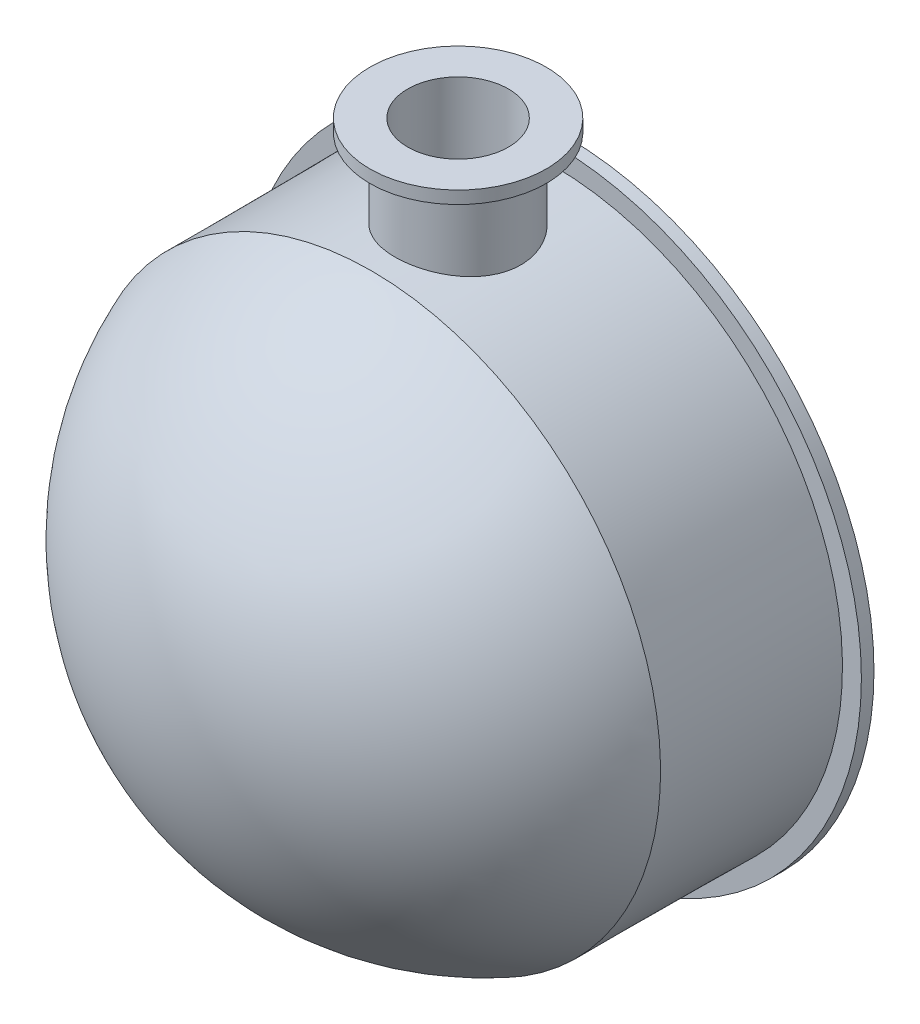
ISO-10303-21;
HEADER;
FILE_DESCRIPTION(('STEP AP214'),'2;1');
FILE_NAME('part.step','',(''),(''),'','','');
FILE_SCHEMA(('AUTOMOTIVE_DESIGN { 1 0 10303 214 1 1 1 1 }'));
ENDSEC;
DATA;
#1=APPLICATION_CONTEXT('core data for automotive mechanical design processes');
#2=APPLICATION_PROTOCOL_DEFINITION('international standard','automotive_design',2000,#1);
#3=PRODUCT_CONTEXT('',#1,'mechanical');
#4=PRODUCT('Part','Part','',(#3));
#5=PRODUCT_RELATED_PRODUCT_CATEGORY('part','',(#4));
#6=PRODUCT_DEFINITION_FORMATION('','',#4);
#7=PRODUCT_DEFINITION_CONTEXT('part definition',#1,'design');
#8=PRODUCT_DEFINITION('design','',#6,#7);
#9=PRODUCT_DEFINITION_SHAPE('','',#8);
#10=(LENGTH_UNIT() NAMED_UNIT(*) SI_UNIT(.MILLI.,.METRE.));
#11=(NAMED_UNIT(*) PLANE_ANGLE_UNIT() SI_UNIT($,.RADIAN.));
#12=(NAMED_UNIT(*) SI_UNIT($,.STERADIAN.) SOLID_ANGLE_UNIT());
#13=UNCERTAINTY_MEASURE_WITH_UNIT(LENGTH_MEASURE(1.E-05),#10,'distance_accuracy_value','');
#14=(GEOMETRIC_REPRESENTATION_CONTEXT(3) GLOBAL_UNCERTAINTY_ASSIGNED_CONTEXT((#13)) GLOBAL_UNIT_ASSIGNED_CONTEXT((#10,
#11,#12)) REPRESENTATION_CONTEXT('',''));
#15=CARTESIAN_POINT('',(0.,0.,0.));
#16=DIRECTION('',(0.,0.,1.));
#17=DIRECTION('',(1.,0.,0.));
#18=AXIS2_PLACEMENT_3D('',#15,#16,#17);
#19=CARTESIAN_POINT('',(0.,-245.001,85.));
#20=DIRECTION('',(0.,1.,0.));
#21=DIRECTION('',(0.,0.,1.));
#22=AXIS2_PLACEMENT_3D('',#19,#20,#21);
#23=CYLINDRICAL_SURFACE('',#22,50.);
#24=CARTESIAN_POINT('',(-35.4781241420228,227.053585489584,49.7678739306976));
#25=CARTESIAN_POINT('',(-36.4650378574734,226.894536222528,50.7616868783154));
#26=CARTESIAN_POINT('',(-37.4102609497926,226.735193766023,51.7970706430749));
#27=CARTESIAN_POINT('',(-39.2107967543285,226.420280433683,53.9439726547816));
#28=CARTESIAN_POINT('',(-40.0660960604967,226.26471012286,55.0555022130419));
#29=CARTESIAN_POINT('',(-41.6813099409951,225.961528320691,57.3479561148434));
#30=CARTESIAN_POINT('',(-42.4411640498901,225.813921907985,58.528923759607));
#31=CARTESIAN_POINT('',(-43.8593920727948,225.530880320074,60.9516343104096));
#32=CARTESIAN_POINT('',(-44.517770011498,225.395444662248,62.1933748035334));
#33=CARTESIAN_POINT('',(-45.7285772420085,225.140465264794,64.7299864229331));
#34=CARTESIAN_POINT('',(-46.2809431953221,225.020931038726,66.0248887542525));
#35=CARTESIAN_POINT('',(-47.2749822792751,224.801248008271,68.658135036125));
#36=CARTESIAN_POINT('',(-47.7166543089995,224.701099396686,69.996479418585));
#37=CARTESIAN_POINT('',(-48.4856558939317,224.523082179764,72.7067165236855));
#38=CARTESIAN_POINT('',(-48.8130147921544,224.445207857774,74.0786005401553));
#39=CARTESIAN_POINT('',(-49.3508203406092,224.313936395497,76.846246196221));
#40=CARTESIAN_POINT('',(-49.5612690069591,224.26053883311,78.2420074236264));
#41=CARTESIAN_POINT('',(-49.8610752316573,224.180354166085,81.0249614004054));
#42=CARTESIAN_POINT('',(-49.9522879178295,224.15316116059,82.4119428217344));
#43=CARTESIAN_POINT('',(-50.0189292642051,224.124611218261,85.1889458545698));
#44=CARTESIAN_POINT('',(-49.9943590402981,224.123254032427,86.5789674366469));
#45=CARTESIAN_POINT('',(-49.8296109891714,224.146273831468,89.3518847411889));
#46=CARTESIAN_POINT('',(-49.6894362206847,224.170650135476,90.7347806512149));
#47=CARTESIAN_POINT('',(-49.2946121347154,224.244261822133,93.4834531060378));
#48=CARTESIAN_POINT('',(-49.0399631691599,224.293497128358,94.8492297034511));
#49=CARTESIAN_POINT('',(-48.4216906813438,224.414541671922,97.5388533789315));
#50=CARTESIAN_POINT('',(-48.059307881108,224.486094328267,98.8629975698894));
#51=CARTESIAN_POINT('',(-47.227386602401,224.649740111248,101.47585300831));
#52=CARTESIAN_POINT('',(-46.7578491397839,224.741833043157,102.764564591552));
#53=CARTESIAN_POINT('',(-45.7150827842687,224.943822384196,105.297974227925));
#54=CARTESIAN_POINT('',(-45.1418465147905,225.053720059802,106.54266914241));
#55=CARTESIAN_POINT('',(-43.8958331283284,225.288118239137,108.979760535407));
#56=CARTESIAN_POINT('',(-43.2230544482614,225.412618972167,110.1721561923));
#57=CARTESIAN_POINT('',(-41.7713481924228,225.674717172918,112.515147570935));
#58=CARTESIAN_POINT('',(-40.9909228741811,225.812489251062,113.664795878414));
#59=CARTESIAN_POINT('',(-39.3376370406178,226.095470965211,115.894606922619));
#60=CARTESIAN_POINT('',(-38.464775705425,226.240680667178,116.974769042894));
#61=CARTESIAN_POINT('',(-36.6324227486595,226.534431176486,119.05863753563));
#62=CARTESIAN_POINT('',(-35.6729223123323,226.682972321612,120.062336109413));
#63=CARTESIAN_POINT('',(-33.6737248851682,226.979203098481,121.986553697899));
#64=CARTESIAN_POINT('',(-32.6340271393408,227.126892722193,122.907071929353));
#65=CARTESIAN_POINT('',(-30.462309036998,227.419859799267,124.674194843557));
#66=CARTESIAN_POINT('',(-29.3289864745701,227.565049134088,125.519214681602));
#67=CARTESIAN_POINT('',(-26.9940587078946,227.846105375582,127.110771288229));
#68=CARTESIAN_POINT('',(-25.7924525961479,227.981972158305,127.857306747502));
#69=CARTESIAN_POINT('',(-23.3292555922674,228.240462879519,129.24641179917));
#70=CARTESIAN_POINT('',(-22.0676667995242,228.363087281004,129.888985026777));
#71=CARTESIAN_POINT('',(-19.493278855762,228.591549035558,131.06533205735));
#72=CARTESIAN_POINT('',(-18.1804803275159,228.697386592696,131.599107182943));
#73=CARTESIAN_POINT('',(-15.5226077157674,228.888504850118,132.550252667552));
#74=CARTESIAN_POINT('',(-14.1778336008463,228.973927897985,132.968432469416));
#75=CARTESIAN_POINT('',(-11.4566478325701,229.12272351738,133.690107565286));
#76=CARTESIAN_POINT('',(-10.0802362704543,229.186096152492,133.993603189987));
#77=CARTESIAN_POINT('',(-7.3059916973337,229.288941213701,134.483394515538));
#78=CARTESIAN_POINT('',(-5.90816118758374,229.328416409003,134.669703795889));
#79=CARTESIAN_POINT('',(-3.10128680205962,229.382323102537,134.923618504976));
#80=CARTESIAN_POINT('',(-1.69224309237348,229.396754971015,134.991225688632));
#81=CARTESIAN_POINT('',(1.09887198392788,229.400121454819,135.007017654618));
#82=CARTESIAN_POINT('',(2.48093021795338,229.389550706048,134.957519176243));
#83=CARTESIAN_POINT('',(5.23579073704766,229.344234794562,134.744297345343));
#84=CARTESIAN_POINT('',(6.60859315239523,229.309489972826,134.580575603953));
#85=CARTESIAN_POINT('',(9.33514321532102,229.216803459669,134.14022904555));
#86=CARTESIAN_POINT('',(10.6888911183809,229.158862079574,133.863605743808));
#87=CARTESIAN_POINT('',(13.3678322467135,229.02140384041,133.199641991551));
#88=CARTESIAN_POINT('',(14.6930253217094,228.941886867825,132.812300958511));
#89=CARTESIAN_POINT('',(17.3037438400605,228.763621884184,131.930544508968));
#90=CARTESIAN_POINT('',(18.5893252647132,228.664902605056,131.43628894366));
#91=CARTESIAN_POINT('',(21.1141871159282,228.450877157492,130.344052658669));
#92=CARTESIAN_POINT('',(22.3534676931093,228.335571043019,129.746072276443));
#93=CARTESIAN_POINT('',(24.777645766187,228.091515080126,128.450629159186));
#94=CARTESIAN_POINT('',(25.9625380948951,227.962763958144,127.753156997627));
#95=CARTESIAN_POINT('',(28.2701160075721,227.695332829416,126.263622451507));
#96=CARTESIAN_POINT('',(29.3928006304103,227.556652669338,125.471558606068));
#97=CARTESIAN_POINT('',(31.5892334882116,227.270461250141,123.782414045929));
#98=CARTESIAN_POINT('',(32.6616619172846,227.122832862631,122.883636486655));
#99=CARTESIAN_POINT('',(34.7272987941957,226.825352394477,120.999568467029));
#100=CARTESIAN_POINT('',(35.720506278764,226.67550028682,120.014276955035));
#101=CARTESIAN_POINT('',(37.6211148587971,226.377819232324,117.963709253164));
#102=CARTESIAN_POINT('',(38.528509215784,226.229990445143,116.898426793759));
#103=CARTESIAN_POINT('',(40.2512188066684,225.94061159074,114.695034325978));
#104=CARTESIAN_POINT('',(41.066533772289,225.799061541811,113.556924105431));
#105=CARTESIAN_POINT('',(42.6075399144435,225.524911371917,111.203002962289));
#106=CARTESIAN_POINT('',(43.33218613026,225.392422398136,109.986494618241));
#107=CARTESIAN_POINT('',(44.6762661686417,225.142080035108,107.495210531761));
#108=CARTESIAN_POINT('',(45.2956990152833,225.02422678162,106.220434248995));
#109=CARTESIAN_POINT('',(46.4245560632898,224.80681434376,103.621689293145));
#110=CARTESIAN_POINT('',(46.9339906728047,224.707253428682,102.297725288162));
#111=CARTESIAN_POINT('',(47.8388791687369,224.529570732241,99.6100032740788));
#112=CARTESIAN_POINT('',(48.2343350542319,224.451448574864,98.246245963377));
#113=CARTESIAN_POINT('',(48.9029384373739,224.320190768538,95.5098176669113));
#114=CARTESIAN_POINT('',(49.1778467476316,224.266694790465,94.1375941020726));
#115=CARTESIAN_POINT('',(49.6117492808648,224.184724250604,91.3741987191269));
#116=CARTESIAN_POINT('',(49.7707445641322,224.156249459938,89.9830270744622));
#117=CARTESIAN_POINT('',(49.9715105901728,224.125334842356,87.1921061473805));
#118=CARTESIAN_POINT('',(50.0132934493609,224.122892324374,85.7923577665454));
#119=CARTESIAN_POINT('',(49.9793476576777,224.144255830882,82.9944957295606));
#120=CARTESIAN_POINT('',(49.9036201704198,224.168061595457,81.5963820573609));
#121=CARTESIAN_POINT('',(49.6377116699164,224.240687239164,78.8368072436733));
#122=CARTESIAN_POINT('',(49.4495838356155,224.28905610974,77.4751357663475));
#123=CARTESIAN_POINT('',(48.9621454492144,224.409273508556,74.7729195748298));
#124=CARTESIAN_POINT('',(48.6628364144279,224.481121716368,73.4323745725808));
#125=CARTESIAN_POINT('',(47.9553953963934,224.646353148208,70.78163539879));
#126=CARTESIAN_POINT('',(47.5472592871466,224.739737188713,69.4714423800411));
#127=CARTESIAN_POINT('',(46.6252930363948,224.945500488639,66.8903295323872));
#128=CARTESIAN_POINT('',(46.1114615930524,225.057879982022,65.6194101874333));
#129=CARTESIAN_POINT('',(44.9772742843771,225.299582834235,63.1150797388412));
#130=CARTESIAN_POINT('',(44.356081982215,225.429037189437,61.8820601653862));
#131=CARTESIAN_POINT('',(43.0145970583337,225.70064974685,59.4726477294793));
#132=CARTESIAN_POINT('',(42.2943041165064,225.842807990095,58.2962550499562));
#133=CARTESIAN_POINT('',(40.7595250965984,226.136027186074,56.0075920032973));
#134=CARTESIAN_POINT('',(39.945028012822,226.287089178004,54.8953291511229));
#135=CARTESIAN_POINT('',(38.227375354719,226.594086285504,52.7422193917341));
#136=CARTESIAN_POINT('',(37.3242184684326,226.750021473163,51.7013735417132));
#137=CARTESIAN_POINT('',(35.4145400855198,227.066065981761,49.6759341245209));
#138=CARTESIAN_POINT('',(34.4061933912496,227.226192148412,48.69306320163));
#139=CARTESIAN_POINT('',(32.3098942705791,227.542854267718,46.8155705395844));
#140=CARTESIAN_POINT('',(31.2219406405958,227.699390166045,45.9209501351761));
#141=CARTESIAN_POINT('',(28.9737007327615,228.004592006165,44.2261553671492));
#142=CARTESIAN_POINT('',(27.8134124395351,228.153257728468,43.4259836368413));
#143=CARTESIAN_POINT('',(25.4283685430601,228.438635296993,41.9258459292871));
#144=CARTESIAN_POINT('',(24.2036132714549,228.575347204701,41.2258794366146));
#145=CARTESIAN_POINT('',(21.6952244846365,228.833332936976,39.9298933888488));
#146=CARTESIAN_POINT('',(20.4114661151911,228.954571760992,39.3341084075272));
#147=CARTESIAN_POINT('',(17.7966120778687,229.177867882313,38.2529987647251));
#148=CARTESIAN_POINT('',(16.4655162131774,229.279925099855,37.7676745625678));
#149=CARTESIAN_POINT('',(13.7657407875155,229.461967634332,36.9114405264882));
#150=CARTESIAN_POINT('',(12.3970665471054,229.541956058354,36.5405145854568));
#151=CARTESIAN_POINT('',(9.63201432782994,229.677604012853,35.9160612599151));
#152=CARTESIAN_POINT('',(8.23563689487152,229.733264022238,35.6625315644378));
#153=CARTESIAN_POINT('',(5.45433695093589,229.817791300223,35.2789733279381));
#154=CARTESIAN_POINT('',(4.06976334544715,229.847182768079,35.1465272230307));
#155=CARTESIAN_POINT('',(1.29409333912561,229.880284565223,34.9974311897477));
#156=CARTESIAN_POINT('',(-0.0970029863859533,229.883995190334,34.9807799275084));
#157=CARTESIAN_POINT('',(-2.87566220857087,229.865632086176,35.0634135295426));
#158=CARTESIAN_POINT('',(-4.26322486974165,229.843556681238,35.1627059282463));
#159=CARTESIAN_POINT('',(-7.02462025482439,229.774229359974,35.4764136788926));
#160=CARTESIAN_POINT('',(-8.3984531342792,229.726977729195,35.690827725128));
#161=CARTESIAN_POINT('',(-11.1066657368185,229.609288994176,36.2298645906195));
#162=CARTESIAN_POINT('',(-12.4413183702826,229.53912757455,36.5531783579723));
#163=CARTESIAN_POINT('',(-15.0783555789569,229.377355783174,37.3080285056092));
#164=CARTESIAN_POINT('',(-16.3807393794887,229.285744897038,37.7395674812966));
#165=CARTESIAN_POINT('',(-18.9436799474876,229.083558875408,38.7073171267504));
#166=CARTESIAN_POINT('',(-20.2042581240921,228.97299363139,39.2434732213408));
#167=CARTESIAN_POINT('',(-22.6758688361389,228.735772346267,40.4166423866229));
#168=CARTESIAN_POINT('',(-23.8869073472597,228.609118253477,41.0536432475916));
#169=CARTESIAN_POINT('',(-26.0207354789631,228.369006557788,42.2901504529414));
#170=CARTESIAN_POINT('',(-26.9536535814575,228.2577976198,42.8727115514449));
#171=CARTESIAN_POINT('',(-28.7787670256343,228.028934413537,44.0977919231756));
#172=CARTESIAN_POINT('',(-29.6709535812979,227.911278766602,44.7403240423341));
#173=CARTESIAN_POINT('',(-31.4107238040844,227.671507110118,46.082477928245));
#174=CARTESIAN_POINT('',(-32.2583056407016,227.549390917864,46.7821020349598));
#175=CARTESIAN_POINT('',(-33.9051666803032,227.302771377165,48.235267106976));
#176=CARTESIAN_POINT('',(-34.7044557246762,227.178268521948,48.9887970182128));
#177=CARTESIAN_POINT('',(-35.4781241420228,227.053585489584,49.7678739306976));
#178=B_SPLINE_CURVE_WITH_KNOTS('',3,(#24,#25,#26,#27,#28,#29,#30,#31,#32,#33,#34,#35,#36,#37,
#38,#39,#40,#41,#42,#43,#44,#45,#46,#47,#48,#49,#50,#51,#52,#53,#54,#55,#56,#57,#58,#59,#60,#61,
#62,#63,#64,#65,#66,#67,#68,#69,#70,#71,#72,#73,#74,#75,#76,#77,#78,#79,#80,#81,#82,#83,#84,#85,
#86,#87,#88,#89,#90,#91,#92,#93,#94,#95,#96,#97,#98,#99,#100,#101,#102,#103,#104,#105,#106,#107,
#108,#109,#110,#111,#112,#113,#114,#115,#116,#117,#118,#119,#120,#121,#122,#123,#124,#125,#126,
#127,#128,#129,#130,#131,#132,#133,#134,#135,#136,#137,#138,#139,#140,#141,#142,#143,#144,#145,
#146,#147,#148,#149,#150,#151,#152,#153,#154,#155,#156,#157,#158,#159,#160,#161,#162,#163,#164,
#165,#166,#167,#168,#169,#170,#171,#172,#173,#174,#175,#176,#177),.UNSPECIFIED.,.T.,.F.,(4,2,2,
2,2,2,2,2,2,2,2,2,2,2,2,2,2,2,2,2,2,2,2,2,2,2,2,2,2,2,2,2,2,2,2,2,2,2,2,2,2,2,2,2,2,2,2,2,2,2,2,
2,2,2,2,2,2,2,2,2,2,2,2,2,2,2,2,2,2,2,2,2,2,2,2,2,4),(0.,4.22782266465638,8.45627473192756,
12.6873921962451,16.9183418050378,21.1518114438061,25.3853231852076,29.6177474271291,
33.8500986785991,38.0157849514535,42.1814310764417,46.3469669878496,50.5124900932706,
54.6317857349764,58.7510423263048,62.8705920548893,66.9902064783324,71.1743553724176,
75.3585413813699,79.5431535745588,83.7278051671741,87.9860604346383,92.2443723082307,
96.5025352506988,100.760646424841,104.988138385531,109.215618156059,113.442607957817,
117.669535266216,121.813541236799,125.957488756801,130.101380662002,134.245294370146,
138.383054689612,142.520801547581,146.658940704487,150.797143779264,155.013281224023,
159.229469926184,163.445989430244,167.66252121898,171.923879935512,176.185278176809,
180.446273023212,184.707193131301,188.903614113649,193.099996709568,197.295945503461,
201.491852748404,205.613362518345,209.734816043223,213.856425848432,217.978086422081,
222.133439023571,226.288805047707,230.444657026872,234.600570512297,238.847152126142,
243.093797957636,247.340562161338,251.587304520154,255.84348900108,260.099691179946,
264.355293817856,268.610812679876,272.779381709175,276.947902719816,281.116694630807,
285.285439260455,289.405762083262,293.526183727064,297.644461606783,301.762241249133,
305.076376433931,308.391223150518,311.706205797157,315.020510602713),.UNSPECIFIED.);
#179=CARTESIAN_POINT('',(-35.4781241420228,227.053585489584,49.7678739306976));
#180=VERTEX_POINT('',#179);
#181=EDGE_CURVE('E10',#180,#180,#178,.T.);
#182=ORIENTED_EDGE('',*,*,#181,.T.);
#183=EDGE_LOOP('',(#182));
#184=FACE_BOUND('',#183,.T.);
#185=CARTESIAN_POINT('',(0.,290.,85.));
#186=DIRECTION('',(0.,1.,0.));
#187=DIRECTION('',(0.,0.,1.));
#188=AXIS2_PLACEMENT_3D('',#185,#186,#187);
#189=CIRCLE('',#188,50.);
#190=CARTESIAN_POINT('',(0.,290.,135.));
#191=VERTEX_POINT('',#190);
#192=EDGE_CURVE('E152',#191,#191,#189,.T.);
#193=ORIENTED_EDGE('',*,*,#192,.F.);
#194=EDGE_LOOP('',(#193));
#195=FACE_BOUND('',#194,.T.);
#196=ADVANCED_FACE('F38',(#184,#195),#23,.T.);
#197=CARTESIAN_POINT('',(0.,0.,0.));
#198=DIRECTION('',(0.,0.,-1.));
#199=DIRECTION('',(0.,1.,0.));
#200=AXIS2_PLACEMENT_3D('',#197,#198,#199);
#201=CYLINDRICAL_SURFACE('',#200,220.);
#202=CARTESIAN_POINT('',(0.,220.,125.));
#203=CARTESIAN_POINT('',(-1.11371799620839,219.999997232441,124.999993557152));
#204=CARTESIAN_POINT('',(-2.22758782375215,219.991521002213,124.953446434489));
#205=CARTESIAN_POINT('',(-4.44743016592897,219.957844419619,124.767593040618));
#206=CARTESIAN_POINT('',(-5.55340117799876,219.932640966662,124.628269572189));
#207=CARTESIAN_POINT('',(-7.75028022669474,219.866190390233,124.257800564989));
#208=CARTESIAN_POINT('',(-8.84117570114069,219.824930634467,124.026582725274));
#209=CARTESIAN_POINT('',(-10.99918262739,219.727523779548,123.474128119162));
#210=CARTESIAN_POINT('',(-12.0662951454205,219.67137734925,123.152895397072));
#211=CARTESIAN_POINT('',(-14.1683893559601,219.545814174232,122.423167811163));
#212=CARTESIAN_POINT('',(-15.2033983698141,219.476409094574,122.014749616964));
#213=CARTESIAN_POINT('',(-17.2351332260522,219.326213582082,121.113505304814));
#214=CARTESIAN_POINT('',(-18.2318586757859,219.245423032514,120.620678321417));
#215=CARTESIAN_POINT('',(-20.1801342018031,219.0746869366,119.554237447594));
#216=CARTESIAN_POINT('',(-21.1316892954194,218.984742410545,118.980632557846));
#217=CARTESIAN_POINT('',(-22.983358821188,218.79815187574,117.756632367155));
#218=CARTESIAN_POINT('',(-23.8834729473162,218.70150582713,117.106236609452));
#219=CARTESIAN_POINT('',(-25.6350853888961,218.503151583878,115.726179434752));
#220=CARTESIAN_POINT('',(-26.4859997420766,218.401402068228,114.995782671221));
#221=CARTESIAN_POINT('',(-28.123449504545,218.196591574658,113.466239642252));
#222=CARTESIAN_POINT('',(-28.9099844636717,218.093530587572,112.667092896172));
#223=CARTESIAN_POINT('',(-30.4133580582823,217.888970244799,111.00544227804));
#224=CARTESIAN_POINT('',(-31.130191997234,217.78747099473,110.142934143492));
#225=CARTESIAN_POINT('',(-32.4891507566622,217.588894036234,108.360459836335));
#226=CARTESIAN_POINT('',(-33.1312754035052,217.491816338084,107.440493530195));
#227=CARTESIAN_POINT('',(-34.3407746508859,217.304138662196,105.542323157067));
#228=CARTESIAN_POINT('',(-34.9075584145011,217.213592172676,104.563737172463));
#229=CARTESIAN_POINT('',(-35.9565666497016,217.042410409799,102.561399579945));
#230=CARTESIAN_POINT('',(-36.4387905800212,216.961775199884,101.537647682976));
#231=CARTESIAN_POINT('',(-37.3150248000575,216.812791501372,99.4522654645072));
#232=CARTESIAN_POINT('',(-37.7090406334191,216.744442240689,98.3906375282794));
#233=CARTESIAN_POINT('',(-38.4058521728645,216.622057494953,96.2370520322338));
#234=CARTESIAN_POINT('',(-38.7086489931892,216.56802183506,95.145094843066));
#235=CARTESIAN_POINT('',(-39.2178423443528,216.476389229703,92.950819056208));
#236=CARTESIAN_POINT('',(-39.4252535653548,216.438619538832,91.8487430961327));
#237=CARTESIAN_POINT('',(-39.7468627006562,216.379790427749,89.6306299687025));
#238=CARTESIAN_POINT('',(-39.8610612249209,216.358730898188,88.5145928927548));
#239=CARTESIAN_POINT('',(-39.995328146776,216.333951125107,86.2767614587576));
#240=CARTESIAN_POINT('',(-40.0154035203961,216.330229596564,85.1549675335524));
#241=CARTESIAN_POINT('',(-39.961281236857,216.340233799416,82.9137387965861));
#242=CARTESIAN_POINT('',(-39.8870842209407,216.353959412135,81.7943039688303));
#243=CARTESIAN_POINT('',(-39.6465145254618,216.398171345376,79.5797548269679));
#244=CARTESIAN_POINT('',(-39.4812936352651,216.428448195128,78.4845109685651));
#245=CARTESIAN_POINT('',(-39.0607639531003,216.504739710144,76.3120292348603));
#246=CARTESIAN_POINT('',(-38.8054560180178,216.550754225716,75.2347911883935));
#247=CARTESIAN_POINT('',(-38.2066879327487,216.657197783594,73.1058070629777));
#248=CARTESIAN_POINT('',(-37.8632253332649,216.717627226403,72.0540616932082));
#249=CARTESIAN_POINT('',(-37.0907083354528,216.851176803141,69.9833234865359));
#250=CARTESIAN_POINT('',(-36.6616531985685,216.924297046577,68.9643309323367));
#251=CARTESIAN_POINT('',(-35.7184082001932,217.081609269951,66.9603590777544));
#252=CARTESIAN_POINT('',(-35.2037509017811,217.16586148662,65.9756045503663));
#253=CARTESIAN_POINT('',(-34.0947092077374,217.34273845873,64.0528627488525));
#254=CARTESIAN_POINT('',(-33.5003246310428,217.435363233185,63.1148755809435));
#255=CARTESIAN_POINT('',(-32.2359241834545,217.626408923108,61.2918618487299));
#256=CARTESIAN_POINT('',(-31.5659022307349,217.724830304361,60.4068395519749));
#257=CARTESIAN_POINT('',(-30.1548397129466,217.924742189321,58.6957144028441));
#258=CARTESIAN_POINT('',(-29.4137984244465,218.026232724283,57.8696121508011));
#259=CARTESIAN_POINT('',(-27.854201288392,218.231003705196,56.2700577597797));
#260=CARTESIAN_POINT('',(-27.0346597407295,218.334288393791,55.4975669053104));
#261=CARTESIAN_POINT('',(-25.3331833052912,218.538243375733,54.0242633579347));
#262=CARTESIAN_POINT('',(-24.451247772186,218.638913642026,53.3234514065733));
#263=CARTESIAN_POINT('',(-22.6310096604336,218.834812468099,51.9984144594614));
#264=CARTESIAN_POINT('',(-21.6927062720344,218.930040949667,51.3741905643282));
#265=CARTESIAN_POINT('',(-19.7662005529161,219.112375997467,50.2068132074296));
#266=CARTESIAN_POINT('',(-18.7779984145969,219.199482595012,49.6636594331055));
#267=CARTESIAN_POINT('',(-16.7574032226654,219.363209880583,48.6618316248721));
#268=CARTESIAN_POINT('',(-15.7249610731462,219.439818500824,48.2032546089225));
#269=CARTESIAN_POINT('',(-13.6242255588391,219.58025535007,47.3748047818671));
#270=CARTESIAN_POINT('',(-12.5559321057546,219.644083547595,47.0049321892462));
#271=CARTESIAN_POINT('',(-10.3912438306206,219.757130739998,46.3567802740121));
#272=CARTESIAN_POINT('',(-9.29485130345996,219.806350923826,46.0784934969956));
#273=CARTESIAN_POINT('',(-7.08186336244214,219.88877438092,45.6156751955422));
#274=CARTESIAN_POINT('',(-5.96526820402343,219.921977856552,45.4311424865522));
#275=CARTESIAN_POINT('',(-3.73572594513792,219.971067048433,45.1592172960904));
#276=CARTESIAN_POINT('',(-2.62294439727383,219.987187379204,45.070508462905));
#277=CARTESIAN_POINT('',(-0.393748611477895,220.002471093915,44.9863895001369));
#278=CARTESIAN_POINT('',(0.72266559274196,220.001634634772,44.9909785071808));
#279=CARTESIAN_POINT('',(2.95101330213672,219.983028829082,45.0934154863653));
#280=CARTESIAN_POINT('',(4.06294699960164,219.965260217156,45.1912594125364));
#281=CARTESIAN_POINT('',(6.27437257088769,219.91329100363,45.4794280724946));
#282=CARTESIAN_POINT('',(7.37386446327331,219.879090426552,45.6697526682723));
#283=CARTESIAN_POINT('',(9.54456527243266,219.795524256902,46.1396673279272));
#284=CARTESIAN_POINT('',(10.6159222908494,219.74627148381,46.4185938938203));
#285=CARTESIAN_POINT('',(12.7311681869925,219.633875275487,47.0640004639375));
#286=CARTESIAN_POINT('',(13.7750572429083,219.570731930391,47.4304799000354));
#287=CARTESIAN_POINT('',(15.8282603974975,219.432278976775,48.2483011601939));
#288=CARTESIAN_POINT('',(16.8375728015253,219.356968772972,48.6996471366569));
#289=CARTESIAN_POINT('',(18.8147546250772,219.19623387076,49.6839333140029));
#290=CARTESIAN_POINT('',(19.782623601209,219.110809064174,50.2168743875715));
#291=CARTESIAN_POINT('',(21.6802255262709,218.931234854939,51.3665174511239));
#292=CARTESIAN_POINT('',(22.609460565349,218.837004360883,51.9840286781504));
#293=CARTESIAN_POINT('',(24.4127662341535,218.643178260943,53.2941806573715));
#294=CARTESIAN_POINT('',(25.286836537133,218.543582623287,53.9868218545034));
#295=CARTESIAN_POINT('',(26.974012521689,218.341761211094,55.4425280279788));
#296=CARTESIAN_POINT('',(27.7871135135396,218.239535235044,56.205598411646));
#297=CARTESIAN_POINT('',(29.3468123626048,218.035280121046,57.7969506286938));
#298=CARTESIAN_POINT('',(30.093409752685,217.933250984485,58.6252329200587));
#299=CARTESIAN_POINT('',(31.5238978670697,217.730963159709,60.3521486288889));
#300=CARTESIAN_POINT('',(32.2068912351593,217.630742377869,61.2515301030343));
#301=CARTESIAN_POINT('',(33.4946853250228,217.436267216661,63.1052575044674));
#302=CARTESIAN_POINT('',(34.0994853086613,217.34201289362,64.0596039504944));
#303=CARTESIAN_POINT('',(35.2265064442836,217.162195218871,66.0166328567368));
#304=CARTESIAN_POINT('',(35.7487295296448,217.076631663701,67.0193141845676));
#305=CARTESIAN_POINT('',(36.7067395766287,216.916692013764,69.0660135246615));
#306=CARTESIAN_POINT('',(37.1425272611848,216.842315825428,70.1100311911058));
#307=CARTESIAN_POINT('',(37.9225214028508,216.707264351167,72.2270243308762));
#308=CARTESIAN_POINT('',(38.2671473320663,216.646526512096,73.2998412306826));
#309=CARTESIAN_POINT('',(38.8648237776655,216.540106514318,75.4714274664905));
#310=CARTESIAN_POINT('',(39.1178744552284,216.494424329112,76.5701967568104));
#311=CARTESIAN_POINT('',(39.530380347691,216.419483990361,78.7856229497876));
#312=CARTESIAN_POINT('',(39.6898438519191,216.390224382224,79.9022782592176));
#313=CARTESIAN_POINT('',(39.9139263714242,216.349003983176,82.1453782981222));
#314=CARTESIAN_POINT('',(39.9785464699321,216.337042994693,83.2718229156429));
#315=CARTESIAN_POINT('',(40.0121701662578,216.330826454463,85.5093522662435));
#316=CARTESIAN_POINT('',(39.9825865790918,216.336309288779,86.6204152977475));
#317=CARTESIAN_POINT('',(39.8311181097455,216.364248307213,88.8360069589634));
#318=CARTESIAN_POINT('',(39.7092342031945,216.386704311922,89.9405356576199));
#319=CARTESIAN_POINT('',(39.3741225541231,216.447932338146,92.1351706983066));
#320=CARTESIAN_POINT('',(39.1608957379037,216.486704194203,93.2252771864756));
#321=CARTESIAN_POINT('',(38.6447457998487,216.579436418215,95.3833806076507));
#322=CARTESIAN_POINT('',(38.3418223517873,216.63339684141,96.451377460229));
#323=CARTESIAN_POINT('',(37.6491539272717,216.754848874741,98.5560519857634));
#324=CARTESIAN_POINT('',(37.2595544954359,216.822317782911,99.5927788908893));
#325=CARTESIAN_POINT('',(36.3961214613851,216.968923944453,101.629671354787));
#326=CARTESIAN_POINT('',(35.9222880851693,217.048061166518,102.629837011643));
#327=CARTESIAN_POINT('',(34.8937650554056,217.215783307757,104.586914829363));
#328=CARTESIAN_POINT('',(34.3390715620896,217.304368675536,105.54382493334));
#329=CARTESIAN_POINT('',(33.1527248437544,217.488521581334,107.407978496934));
#330=CARTESIAN_POINT('',(32.5210707601225,217.584089197247,108.315221402273));
#331=CARTESIAN_POINT('',(31.1756969193421,217.780955188592,110.086452421118));
#332=CARTESIAN_POINT('',(30.4609457466721,217.88231536173,110.94965041379));
#333=CARTESIAN_POINT('',(28.9616664009349,218.086666522948,112.612959357913));
#334=CARTESIAN_POINT('',(28.1771374012307,218.189657530335,113.413069561769));
#335=CARTESIAN_POINT('',(26.5434628011306,218.394419038652,114.944928292463));
#336=CARTESIAN_POINT('',(25.6943023137681,218.496189252101,115.676660982498));
#337=CARTESIAN_POINT('',(23.9372916698761,218.695650651911,117.066505009049));
#338=CARTESIAN_POINT('',(23.0294420544754,218.793341875866,117.724617024215));
#339=CARTESIAN_POINT('',(21.1533609920987,218.982719568851,118.967811354746));
#340=CARTESIAN_POINT('',(20.1846867097296,219.074348758053,119.552234369408));
#341=CARTESIAN_POINT('',(18.2005966364062,219.248101069033,120.637294924032));
#342=CARTESIAN_POINT('',(17.1851782547787,219.330223663043,121.137927812993));
#343=CARTESIAN_POINT('',(15.115733724946,219.482550861641,122.051218144963));
#344=CARTESIAN_POINT('',(14.0617419555925,219.552765778998,122.463951794117));
#345=CARTESIAN_POINT('',(11.9219508488989,219.679345647933,123.198771580317));
#346=CARTESIAN_POINT('',(10.8361580876353,219.735713440617,123.520876314276));
#347=CARTESIAN_POINT('',(8.9438748080332,219.819563721234,123.995880687843));
#348=CARTESIAN_POINT('',(8.14303118050974,219.850724520094,124.17094366505));
#349=CARTESIAN_POINT('',(6.53165657979852,219.904495504715,124.471624573187));
#350=CARTESIAN_POINT('',(5.72112412139617,219.927104361739,124.597234820635));
#351=CARTESIAN_POINT('',(4.09368824635418,219.963415493219,124.798416560194));
#352=CARTESIAN_POINT('',(3.27678494143785,219.977117923512,124.873988927815));
#353=CARTESIAN_POINT('',(1.6399481889973,219.995410463494,124.974778973106));
#354=CARTESIAN_POINT('',(0.820015249706491,220.000002037716,125.00000474378));
#355=CARTESIAN_POINT('',(0.,220.,125.));
#356=B_SPLINE_CURVE_WITH_KNOTS('',3,(#202,#203,#204,#205,#206,#207,#208,#209,#210,#211,#212,
#213,#214,#215,#216,#217,#218,#219,#220,#221,#222,#223,#224,#225,#226,#227,#228,#229,#230,#231,
#232,#233,#234,#235,#236,#237,#238,#239,#240,#241,#242,#243,#244,#245,#246,#247,#248,#249,#250,
#251,#252,#253,#254,#255,#256,#257,#258,#259,#260,#261,#262,#263,#264,#265,#266,#267,#268,#269,
#270,#271,#272,#273,#274,#275,#276,#277,#278,#279,#280,#281,#282,#283,#284,#285,#286,#287,#288,
#289,#290,#291,#292,#293,#294,#295,#296,#297,#298,#299,#300,#301,#302,#303,#304,#305,#306,#307,
#308,#309,#310,#311,#312,#313,#314,#315,#316,#317,#318,#319,#320,#321,#322,#323,#324,#325,#326,
#327,#328,#329,#330,#331,#332,#333,#334,#335,#336,#337,#338,#339,#340,#341,#342,#343,#344,#345,
#346,#347,#348,#349,#350,#351,#352,#353,#354,#355),.UNSPECIFIED.,.T.,.F.,(4,2,2,2,2,2,2,2,2,2,2,
2,2,2,2,2,2,2,2,2,2,2,2,2,2,2,2,2,2,2,2,2,2,2,2,2,2,2,2,2,2,2,2,2,2,2,2,2,2,2,2,2,2,2,2,2,2,2,2,
2,2,2,2,2,2,2,2,2,2,2,2,2,2,2,2,2,4),(0.,3.34041505657667,6.68144947202007,10.0251177774894,
13.3686358783027,16.7092257623441,20.0498498995624,23.3901021018862,26.7303741734117,
30.1044390833817,33.4785275838775,36.8528432768826,40.227166812049,43.6265613970069,
47.0259777406215,50.4251803799251,53.8243414962633,57.1864554547235,60.5485474120052,
63.9103901806028,67.2722100819957,70.592436296474,73.9126309306386,77.2329178233814,
80.5532333672667,83.892313749344,87.2314017147013,90.5707583598738,93.9101490246947,
97.2990108862099,100.687907803221,104.076853415054,107.465785960765,110.858582094097,
114.251386584025,117.643914856599,121.03640026458,124.381665373613,127.726899525757,
131.071988547771,134.417072577903,137.737675073231,141.05825602192,144.378999484346,
147.699778465664,151.054900185543,154.410041776322,157.765441178575,161.120864147961,
164.518100669125,167.915369257417,171.312558293493,174.709718914761,178.090964643883,
181.472204421737,184.853144666682,188.23404629674,191.564483161955,194.894884824404,
198.225252714321,201.555632716898,204.880462062733,208.205282488198,211.530260849374,
214.855276309149,218.22716769105,221.599099024059,224.971809398897,228.344488680921,
231.745474996954,235.14665003151,238.544864230571,241.942380611918,244.401938796569,
246.861878972657,249.321776106206,251.781277789817),.UNSPECIFIED.);
#357=CARTESIAN_POINT('',(0.,220.,125.));
#358=VERTEX_POINT('',#357);
#359=EDGE_CURVE('E82',#358,#358,#356,.T.);
#360=ORIENTED_EDGE('',*,*,#359,.F.);
#361=EDGE_LOOP('',(#360));
#362=FACE_BOUND('',#361,.T.);
#363=CARTESIAN_POINT('',(0.,0.,0.));
#364=DIRECTION('',(0.,0.,-1.));
#365=DIRECTION('',(0.,1.,0.));
#366=AXIS2_PLACEMENT_3D('',#363,#364,#365);
#367=CIRCLE('',#366,220.);
#368=CARTESIAN_POINT('',(0.,220.,0.));
#369=VERTEX_POINT('',#368);
#370=EDGE_CURVE('E52',#369,#369,#367,.T.);
#371=ORIENTED_EDGE('',*,*,#370,.T.);
#372=EDGE_LOOP('',(#371));
#373=FACE_BOUND('',#372,.T.);
#374=CARTESIAN_POINT('',(0.,0.,150.));
#375=DIRECTION('',(0.,0.,-1.));
#376=DIRECTION('',(0.,1.,0.));
#377=AXIS2_PLACEMENT_3D('',#374,#375,#376);
#378=CIRCLE('',#377,220.);
#379=CARTESIAN_POINT('',(0.,220.,150.));
#380=VERTEX_POINT('',#379);
#381=EDGE_CURVE('E78',#380,#380,#378,.T.);
#382=ORIENTED_EDGE('',*,*,#381,.F.);
#383=EDGE_LOOP('',(#382));
#384=FACE_BOUND('',#383,.T.);
#385=ADVANCED_FACE('F40',(#362,#373,#384),#201,.F.);
#386=CARTESIAN_POINT('',(0.,220.,0.));
#387=DIRECTION('',(0.,0.,-1.));
#388=DIRECTION('',(0.,1.,0.));
#389=AXIS2_PLACEMENT_3D('',#386,#387,#388);
#390=PLANE('',#389);
#391=CARTESIAN_POINT('',(0.,0.,0.));
#392=DIRECTION('',(0.,0.,-1.));
#393=DIRECTION('',(0.,1.,0.));
#394=AXIS2_PLACEMENT_3D('',#391,#392,#393);
#395=CIRCLE('',#394,245.);
#396=CARTESIAN_POINT('',(0.,245.,0.));
#397=VERTEX_POINT('',#396);
#398=EDGE_CURVE('E58',#397,#397,#395,.T.);
#399=ORIENTED_EDGE('',*,*,#398,.T.);
#400=EDGE_LOOP('',(#399));
#401=FACE_BOUND('',#400,.T.);
#402=ORIENTED_EDGE('',*,*,#370,.F.);
#403=EDGE_LOOP('',(#402));
#404=FACE_BOUND('',#403,.T.);
#405=ADVANCED_FACE('F124',(#401,#404),#390,.T.);
#406=CARTESIAN_POINT('',(0.,0.,0.));
#407=DIRECTION('',(0.,0.,-1.));
#408=DIRECTION('',(0.,1.,0.));
#409=AXIS2_PLACEMENT_3D('',#406,#407,#408);
#410=CYLINDRICAL_SURFACE('',#409,245.);
#411=CARTESIAN_POINT('',(0.,0.,9.99999999999997));
#412=DIRECTION('',(0.,0.,-1.));
#413=DIRECTION('',(0.,1.,0.));
#414=AXIS2_PLACEMENT_3D('',#411,#412,#413);
#415=CIRCLE('',#414,245.);
#416=CARTESIAN_POINT('',(0.,245.,10.));
#417=VERTEX_POINT('',#416);
#418=EDGE_CURVE('E64',#417,#417,#415,.T.);
#419=ORIENTED_EDGE('',*,*,#418,.T.);
#420=EDGE_LOOP('',(#419));
#421=FACE_BOUND('',#420,.T.);
#422=ORIENTED_EDGE('',*,*,#398,.F.);
#423=EDGE_LOOP('',(#422));
#424=FACE_BOUND('',#423,.T.);
#425=ADVANCED_FACE('F121',(#421,#424),#410,.T.);
#426=CARTESIAN_POINT('',(0.,245.,10.));
#427=DIRECTION('',(0.,0.,1.));
#428=DIRECTION('',(0.,-1.,0.));
#429=AXIS2_PLACEMENT_3D('',#426,#427,#428);
#430=PLANE('',#429);
#431=CARTESIAN_POINT('',(0.,0.,9.99999999999997));
#432=DIRECTION('',(0.,0.,-1.));
#433=DIRECTION('',(0.,1.,0.));
#434=AXIS2_PLACEMENT_3D('',#431,#432,#433);
#435=CIRCLE('',#434,230.);
#436=CARTESIAN_POINT('',(0.,230.,10.));
#437=VERTEX_POINT('',#436);
#438=EDGE_CURVE('E70',#437,#437,#435,.T.);
#439=ORIENTED_EDGE('',*,*,#438,.T.);
#440=EDGE_LOOP('',(#439));
#441=FACE_BOUND('',#440,.T.);
#442=ORIENTED_EDGE('',*,*,#418,.F.);
#443=EDGE_LOOP('',(#442));
#444=FACE_BOUND('',#443,.T.);
#445=ADVANCED_FACE('F117',(#441,#444),#430,.T.);
#446=CARTESIAN_POINT('',(0.,0.,9.99999999999997));
#447=DIRECTION('',(0.,0.,-1.));
#448=DIRECTION('',(0.,1.,0.));
#449=AXIS2_PLACEMENT_3D('',#446,#447,#448);
#450=CONICAL_SURFACE('',#449,230.,0.00481095944614757);
#451=ORIENTED_EDGE('',*,*,#181,.F.);
#452=EDGE_LOOP('',(#451));
#453=FACE_BOUND('',#452,.T.);
#454=CARTESIAN_POINT('',(0.,0.,153.653032440056));
#455=DIRECTION('',(0.,0.,-1.));
#456=DIRECTION('',(0.,1.,0.));
#457=AXIS2_PLACEMENT_3D('',#454,#455,#456);
#458=CIRCLE('',#457,229.308885754584);
#459=CARTESIAN_POINT('',(0.,229.308885754584,153.653032440056));
#460=VERTEX_POINT('',#459);
#461=EDGE_CURVE('E74',#460,#460,#458,.T.);
#462=ORIENTED_EDGE('',*,*,#461,.T.);
#463=EDGE_LOOP('',(#462));
#464=FACE_BOUND('',#463,.T.);
#465=ORIENTED_EDGE('',*,*,#438,.F.);
#466=EDGE_LOOP('',(#465));
#467=FACE_BOUND('',#466,.T.);
#468=ADVANCED_FACE('F112',(#453,#464,#467),#450,.T.);
#469=CARTESIAN_POINT('',(0.,0.,63.6666666666666));
#470=DIRECTION('',(0.,0.,-1.));
#471=DIRECTION('',(0.,1.,0.));
#472=AXIS2_PLACEMENT_3D('',#469,#470,#471);
#473=SPHERICAL_SURFACE('',#472,246.333333333333);
#474=ORIENTED_EDGE('',*,*,#461,.F.);
#475=EDGE_LOOP('',(#474));
#476=FACE_BOUND('',#475,.T.);
#477=ADVANCED_FACE('F109',(#476),#473,.T.);
#478=CARTESIAN_POINT('',(0.,0.,63.6666666666666));
#479=DIRECTION('',(0.,0.,-1.));
#480=DIRECTION('',(0.,1.,0.));
#481=AXIS2_PLACEMENT_3D('',#478,#479,#480);
#482=SPHERICAL_SURFACE('',#481,236.333333333333);
#483=ORIENTED_EDGE('',*,*,#381,.T.);
#484=EDGE_LOOP('',(#483));
#485=FACE_BOUND('',#484,.T.);
#486=ADVANCED_FACE('F102',(#485),#482,.F.);
#487=CARTESIAN_POINT('',(0.,300.,85.));
#488=DIRECTION('',(0.,1.,0.));
#489=DIRECTION('',(0.,0.,1.));
#490=AXIS2_PLACEMENT_3D('',#487,#488,#489);
#491=PLANE('',#490);
#492=CARTESIAN_POINT('',(0.,300.,85.));
#493=DIRECTION('',(0.,1.,0.));
#494=DIRECTION('',(0.,0.,1.));
#495=AXIS2_PLACEMENT_3D('',#492,#493,#494);
#496=CIRCLE('',#495,40.);
#497=CARTESIAN_POINT('',(0.,300.,125.));
#498=VERTEX_POINT('',#497);
#499=EDGE_CURVE('E90',#498,#498,#496,.T.);
#500=ORIENTED_EDGE('',*,*,#499,.F.);
#501=EDGE_LOOP('',(#500));
#502=FACE_BOUND('',#501,.T.);
#503=CARTESIAN_POINT('',(0.,300.,85.));
#504=DIRECTION('',(0.,1.,0.));
#505=DIRECTION('',(0.,0.,1.));
#506=AXIS2_PLACEMENT_3D('',#503,#504,#505);
#507=CIRCLE('',#506,70.);
#508=CARTESIAN_POINT('',(0.,300.,155.));
#509=VERTEX_POINT('',#508);
#510=EDGE_CURVE('E146',#509,#509,#507,.T.);
#511=ORIENTED_EDGE('',*,*,#510,.T.);
#512=EDGE_LOOP('',(#511));
#513=FACE_BOUND('',#512,.T.);
#514=ADVANCED_FACE('F98',(#502,#513),#491,.T.);
#515=CARTESIAN_POINT('',(0.,195.098,85.));
#516=DIRECTION('',(0.,1.,0.));
#517=DIRECTION('',(0.,0.,1.));
#518=AXIS2_PLACEMENT_3D('',#515,#516,#517);
#519=CYLINDRICAL_SURFACE('',#518,40.);
#520=ORIENTED_EDGE('',*,*,#359,.T.);
#521=EDGE_LOOP('',(#520));
#522=FACE_BOUND('',#521,.T.);
#523=ORIENTED_EDGE('',*,*,#499,.T.);
#524=EDGE_LOOP('',(#523));
#525=FACE_BOUND('',#524,.T.);
#526=ADVANCED_FACE('F92',(#522,#525),#519,.F.);
#527=CARTESIAN_POINT('',(0.,290.,85.));
#528=DIRECTION('',(0.,1.,0.));
#529=DIRECTION('',(0.,0.,1.));
#530=AXIS2_PLACEMENT_3D('',#527,#528,#529);
#531=CYLINDRICAL_SURFACE('',#530,70.);
#532=CARTESIAN_POINT('',(0.,290.,85.));
#533=DIRECTION('',(0.,1.,0.));
#534=DIRECTION('',(0.,0.,1.));
#535=AXIS2_PLACEMENT_3D('',#532,#533,#534);
#536=CIRCLE('',#535,70.);
#537=CARTESIAN_POINT('',(0.,290.,155.));
#538=VERTEX_POINT('',#537);
#539=EDGE_CURVE('E143',#538,#538,#536,.T.);
#540=ORIENTED_EDGE('',*,*,#539,.T.);
#541=EDGE_LOOP('',(#540));
#542=FACE_BOUND('',#541,.T.);
#543=ORIENTED_EDGE('',*,*,#510,.F.);
#544=EDGE_LOOP('',(#543));
#545=FACE_BOUND('',#544,.T.);
#546=ADVANCED_FACE('F97',(#542,#545),#531,.T.);
#547=CARTESIAN_POINT('',(0.,290.,85.));
#548=DIRECTION('',(0.,1.,0.));
#549=DIRECTION('',(0.,0.,1.));
#550=AXIS2_PLACEMENT_3D('',#547,#548,#549);
#551=PLANE('',#550);
#552=ORIENTED_EDGE('',*,*,#192,.T.);
#553=EDGE_LOOP('',(#552));
#554=FACE_BOUND('',#553,.T.);
#555=ORIENTED_EDGE('',*,*,#539,.F.);
#556=EDGE_LOOP('',(#555));
#557=FACE_BOUND('',#556,.T.);
#558=ADVANCED_FACE('F157',(#554,#557),#551,.F.);
#559=CLOSED_SHELL('',(#196,#385,#405,#425,#445,#468,#477,#486,#514,#526,#546,#558));
#560=MANIFOLD_SOLID_BREP('B2',#559);
#561=ADVANCED_BREP_SHAPE_REPRESENTATION('',(#18,#560),#14);
#562=SHAPE_DEFINITION_REPRESENTATION(#9,#561);
ENDSEC;
END-ISO-10303-21;
